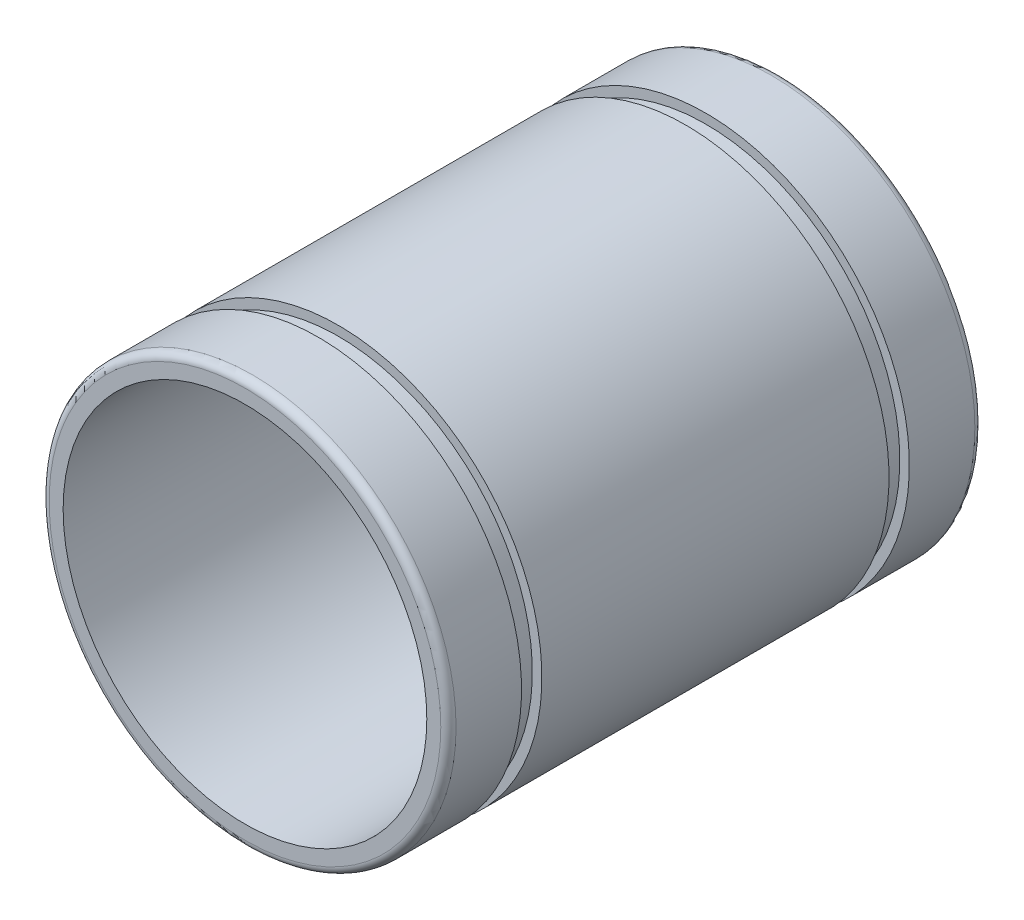
ISO-10303-21;
HEADER;
FILE_DESCRIPTION(('STEP AP214'),'2;1');
FILE_NAME('part.step','',(''),(''),'','','');
FILE_SCHEMA(('AUTOMOTIVE_DESIGN { 1 0 10303 214 1 1 1 1 }'));
ENDSEC;
DATA;
#1=APPLICATION_CONTEXT('core data for automotive mechanical design processes');
#2=APPLICATION_PROTOCOL_DEFINITION('international standard','automotive_design',2000,#1);
#3=PRODUCT_CONTEXT('',#1,'mechanical');
#4=PRODUCT('Part','Part','',(#3));
#5=PRODUCT_RELATED_PRODUCT_CATEGORY('part','',(#4));
#6=PRODUCT_DEFINITION_FORMATION('','',#4);
#7=PRODUCT_DEFINITION_CONTEXT('part definition',#1,'design');
#8=PRODUCT_DEFINITION('design','',#6,#7);
#9=PRODUCT_DEFINITION_SHAPE('','',#8);
#10=(LENGTH_UNIT() NAMED_UNIT(*) SI_UNIT(.MILLI.,.METRE.));
#11=(NAMED_UNIT(*) PLANE_ANGLE_UNIT() SI_UNIT($,.RADIAN.));
#12=(NAMED_UNIT(*) SI_UNIT($,.STERADIAN.) SOLID_ANGLE_UNIT());
#13=UNCERTAINTY_MEASURE_WITH_UNIT(LENGTH_MEASURE(1.E-05),#10,'distance_accuracy_value','');
#14=(GEOMETRIC_REPRESENTATION_CONTEXT(3) GLOBAL_UNCERTAINTY_ASSIGNED_CONTEXT((#13)) GLOBAL_UNIT_ASSIGNED_CONTEXT((#10,
#11,#12)) REPRESENTATION_CONTEXT('',''));
#15=CARTESIAN_POINT('',(0.,0.,0.));
#16=DIRECTION('',(0.,0.,1.));
#17=DIRECTION('',(1.,0.,0.));
#18=AXIS2_PLACEMENT_3D('',#15,#16,#17);
#19=CARTESIAN_POINT('',(0.,0.,42.));
#20=DIRECTION('',(0.,0.,-1.));
#21=DIRECTION('',(-1.,0.,0.));
#22=AXIS2_PLACEMENT_3D('',#19,#20,#21);
#23=CYLINDRICAL_SURFACE('',#22,16.);
#24=CARTESIAN_POINT('',(0.,0.,7.35000000000001));
#25=DIRECTION('',(0.,0.,-1.));
#26=DIRECTION('',(-1.,0.,0.));
#27=AXIS2_PLACEMENT_3D('',#24,#25,#26);
#28=CIRCLE('',#27,16.);
#29=CARTESIAN_POINT('',(-16.,0.,7.35000000000001));
#30=VERTEX_POINT('',#29);
#31=EDGE_CURVE('E54',#30,#30,#28,.T.);
#32=CARTESIAN_POINT('',(0.,0.,34.65));
#33=DIRECTION('',(0.,0.,-1.));
#34=DIRECTION('',(-1.,0.,0.));
#35=AXIS2_PLACEMENT_3D('',#32,#33,#34);
#36=CIRCLE('',#35,16.);
#37=CARTESIAN_POINT('',(-16.,0.,34.65));
#38=VERTEX_POINT('',#37);
#39=EDGE_CURVE('E68',#38,#38,#36,.T.);
#40=CARTESIAN_POINT('',(-16.,0.,7.35000000000001));
#41=CARTESIAN_POINT('',(-16.,0.,7.63437500000001));
#42=CARTESIAN_POINT('',(-16.,0.,7.91875000000001));
#43=CARTESIAN_POINT('',(-16.,0.,8.48750000000001));
#44=CARTESIAN_POINT('',(-16.,0.,8.77187500000001));
#45=CARTESIAN_POINT('',(-16.,0.,9.34062500000001));
#46=CARTESIAN_POINT('',(-16.,0.,9.62500000000001));
#47=CARTESIAN_POINT('',(-16.,0.,10.19375));
#48=CARTESIAN_POINT('',(-16.,0.,10.478125));
#49=CARTESIAN_POINT('',(-16.,0.,11.046875));
#50=CARTESIAN_POINT('',(-16.,0.,11.33125));
#51=CARTESIAN_POINT('',(-16.,0.,11.9));
#52=CARTESIAN_POINT('',(-16.,0.,12.184375));
#53=CARTESIAN_POINT('',(-16.,0.,12.753125));
#54=CARTESIAN_POINT('',(-16.,0.,13.0375));
#55=CARTESIAN_POINT('',(-16.,0.,13.60625));
#56=CARTESIAN_POINT('',(-16.,0.,13.890625));
#57=CARTESIAN_POINT('',(-16.,0.,14.459375));
#58=CARTESIAN_POINT('',(-16.,0.,14.74375));
#59=CARTESIAN_POINT('',(-16.,0.,15.3125));
#60=CARTESIAN_POINT('',(-16.,0.,15.596875));
#61=CARTESIAN_POINT('',(-16.,0.,16.165625));
#62=CARTESIAN_POINT('',(-16.,0.,16.45));
#63=CARTESIAN_POINT('',(-16.,0.,17.01875));
#64=CARTESIAN_POINT('',(-16.,0.,17.303125));
#65=CARTESIAN_POINT('',(-16.,0.,17.871875));
#66=CARTESIAN_POINT('',(-16.,0.,18.15625));
#67=CARTESIAN_POINT('',(-16.,0.,18.725));
#68=CARTESIAN_POINT('',(-16.,0.,19.009375));
#69=CARTESIAN_POINT('',(-16.,0.,19.578125));
#70=CARTESIAN_POINT('',(-16.,0.,19.8625));
#71=CARTESIAN_POINT('',(-16.,0.,20.43125));
#72=CARTESIAN_POINT('',(-16.,0.,20.715625));
#73=CARTESIAN_POINT('',(-16.,0.,21.284375));
#74=CARTESIAN_POINT('',(-16.,0.,21.56875));
#75=CARTESIAN_POINT('',(-16.,0.,22.1375));
#76=CARTESIAN_POINT('',(-16.,0.,22.421875));
#77=CARTESIAN_POINT('',(-16.,0.,22.990625));
#78=CARTESIAN_POINT('',(-16.,0.,23.275));
#79=CARTESIAN_POINT('',(-16.,0.,23.84375));
#80=CARTESIAN_POINT('',(-16.,0.,24.128125));
#81=CARTESIAN_POINT('',(-16.,0.,24.696875));
#82=CARTESIAN_POINT('',(-16.,0.,24.98125));
#83=CARTESIAN_POINT('',(-16.,0.,25.55));
#84=CARTESIAN_POINT('',(-16.,0.,25.834375));
#85=CARTESIAN_POINT('',(-16.,0.,26.403125));
#86=CARTESIAN_POINT('',(-16.,0.,26.6875));
#87=CARTESIAN_POINT('',(-16.,0.,27.25625));
#88=CARTESIAN_POINT('',(-16.,0.,27.540625));
#89=CARTESIAN_POINT('',(-16.,0.,28.109375));
#90=CARTESIAN_POINT('',(-16.,0.,28.39375));
#91=CARTESIAN_POINT('',(-16.,0.,28.9625));
#92=CARTESIAN_POINT('',(-16.,0.,29.246875));
#93=CARTESIAN_POINT('',(-16.,0.,29.815625));
#94=CARTESIAN_POINT('',(-16.,0.,30.1));
#95=CARTESIAN_POINT('',(-16.,0.,30.66875));
#96=CARTESIAN_POINT('',(-16.,0.,30.953125));
#97=CARTESIAN_POINT('',(-16.,0.,31.521875));
#98=CARTESIAN_POINT('',(-16.,0.,31.80625));
#99=CARTESIAN_POINT('',(-16.,0.,32.375));
#100=CARTESIAN_POINT('',(-16.,0.,32.659375));
#101=CARTESIAN_POINT('',(-16.,0.,33.228125));
#102=CARTESIAN_POINT('',(-16.,0.,33.5125));
#103=CARTESIAN_POINT('',(-16.,0.,34.08125));
#104=CARTESIAN_POINT('',(-16.,0.,34.365625));
#105=CARTESIAN_POINT('',(-16.,0.,34.65));
#106=B_SPLINE_CURVE_WITH_KNOTS('',3,(#40,#41,#42,#43,#44,#45,#46,#47,#48,#49,#50,#51,#52,#53,
#54,#55,#56,#57,#58,#59,#60,#61,#62,#63,#64,#65,#66,#67,#68,#69,#70,#71,#72,#73,#74,#75,#76,#77,
#78,#79,#80,#81,#82,#83,#84,#85,#86,#87,#88,#89,#90,#91,#92,#93,#94,#95,#96,#97,#98,#99,#100,
#101,#102,#103,#104,#105),.UNSPECIFIED.,.F.,.F.,(4,2,2,2,2,2,2,2,2,2,2,2,2,2,2,2,2,2,2,2,2,2,2,
2,2,2,2,2,2,2,2,2,4),(0.,0.853125000000003,1.70625,2.559375,3.4125,4.265625,5.11875,5.971875,
6.825,7.678125,8.53125,9.384375,10.2375,11.090625,11.94375,12.796875,13.65,14.503125,15.35625,
16.209375,17.0625,17.915625,18.76875,19.621875,20.475,21.328125,22.18125,23.034375,23.8875,
24.740625,25.59375,26.446875,27.3),.UNSPECIFIED.);
#107=EDGE_CURVE('BSEAM30',#30,#38,#106,.T.);
#108=ORIENTED_EDGE('',*,*,#31,.F.);
#109=ORIENTED_EDGE('',*,*,#39,.T.);
#110=ORIENTED_EDGE('',*,*,#107,.T.);
#111=ORIENTED_EDGE('',*,*,#107,.F.);
#112=EDGE_LOOP('',(#108,#110,#109,#111));
#113=FACE_BOUND('',#112,.T.);
#114=ADVANCED_FACE('F30',(#113),#23,.T.);
#115=CARTESIAN_POINT('',(0.,0.,41.4));
#116=DIRECTION('',(0.,0.,1.));
#117=DIRECTION('',(1.,0.,0.));
#118=AXIS2_PLACEMENT_3D('',#115,#116,#117);
#119=CIRCLE('',#118,16.);
#120=CARTESIAN_POINT('',(-16.,0.,41.4));
#121=VERTEX_POINT('',#120);
#122=EDGE_CURVE('E10',#121,#121,#119,.F.);
#123=CARTESIAN_POINT('',(0.,0.,36.25));
#124=DIRECTION('',(0.,0.,-1.));
#125=DIRECTION('',(-1.,0.,0.));
#126=AXIS2_PLACEMENT_3D('',#123,#124,#125);
#127=CIRCLE('',#126,16.);
#128=CARTESIAN_POINT('',(-16.,0.,36.25));
#129=VERTEX_POINT('',#128);
#130=EDGE_CURVE('E77',#129,#129,#127,.T.);
#131=CARTESIAN_POINT('',(-16.,0.,41.4));
#132=CARTESIAN_POINT('',(-16.,0.,41.3463541666667));
#133=CARTESIAN_POINT('',(-16.,0.,41.2927083333333));
#134=CARTESIAN_POINT('',(-16.,0.,41.1854166666667));
#135=CARTESIAN_POINT('',(-16.,0.,41.1317708333333));
#136=CARTESIAN_POINT('',(-16.,0.,41.0244791666667));
#137=CARTESIAN_POINT('',(-16.,0.,40.9708333333333));
#138=CARTESIAN_POINT('',(-16.,0.,40.8635416666667));
#139=CARTESIAN_POINT('',(-16.,0.,40.8098958333333));
#140=CARTESIAN_POINT('',(-16.,0.,40.7026041666667));
#141=CARTESIAN_POINT('',(-16.,0.,40.6489583333333));
#142=CARTESIAN_POINT('',(-16.,0.,40.5416666666667));
#143=CARTESIAN_POINT('',(-16.,0.,40.4880208333333));
#144=CARTESIAN_POINT('',(-16.,0.,40.3807291666667));
#145=CARTESIAN_POINT('',(-16.,0.,40.3270833333333));
#146=CARTESIAN_POINT('',(-16.,0.,40.2197916666667));
#147=CARTESIAN_POINT('',(-16.,0.,40.1661458333333));
#148=CARTESIAN_POINT('',(-16.,0.,40.0588541666667));
#149=CARTESIAN_POINT('',(-16.,0.,40.0052083333333));
#150=CARTESIAN_POINT('',(-16.,0.,39.8979166666667));
#151=CARTESIAN_POINT('',(-16.,0.,39.8442708333333));
#152=CARTESIAN_POINT('',(-16.,0.,39.7369791666667));
#153=CARTESIAN_POINT('',(-16.,0.,39.6833333333333));
#154=CARTESIAN_POINT('',(-16.,0.,39.5760416666667));
#155=CARTESIAN_POINT('',(-16.,0.,39.5223958333333));
#156=CARTESIAN_POINT('',(-16.,0.,39.4151041666667));
#157=CARTESIAN_POINT('',(-16.,0.,39.3614583333333));
#158=CARTESIAN_POINT('',(-16.,0.,39.2541666666667));
#159=CARTESIAN_POINT('',(-16.,0.,39.2005208333333));
#160=CARTESIAN_POINT('',(-16.,0.,39.0932291666667));
#161=CARTESIAN_POINT('',(-16.,0.,39.0395833333333));
#162=CARTESIAN_POINT('',(-16.,0.,38.9322916666667));
#163=CARTESIAN_POINT('',(-16.,0.,38.8786458333333));
#164=CARTESIAN_POINT('',(-16.,0.,38.7713541666667));
#165=CARTESIAN_POINT('',(-16.,0.,38.7177083333333));
#166=CARTESIAN_POINT('',(-16.,0.,38.6104166666667));
#167=CARTESIAN_POINT('',(-16.,0.,38.5567708333333));
#168=CARTESIAN_POINT('',(-16.,0.,38.4494791666667));
#169=CARTESIAN_POINT('',(-16.,0.,38.3958333333333));
#170=CARTESIAN_POINT('',(-16.,0.,38.2885416666667));
#171=CARTESIAN_POINT('',(-16.,0.,38.2348958333333));
#172=CARTESIAN_POINT('',(-16.,0.,38.1276041666667));
#173=CARTESIAN_POINT('',(-16.,0.,38.0739583333333));
#174=CARTESIAN_POINT('',(-16.,0.,37.9666666666667));
#175=CARTESIAN_POINT('',(-16.,0.,37.9130208333333));
#176=CARTESIAN_POINT('',(-16.,0.,37.8057291666667));
#177=CARTESIAN_POINT('',(-16.,0.,37.7520833333333));
#178=CARTESIAN_POINT('',(-16.,0.,37.6447916666667));
#179=CARTESIAN_POINT('',(-16.,0.,37.5911458333333));
#180=CARTESIAN_POINT('',(-16.,0.,37.4838541666667));
#181=CARTESIAN_POINT('',(-16.,0.,37.4302083333333));
#182=CARTESIAN_POINT('',(-16.,0.,37.3229166666667));
#183=CARTESIAN_POINT('',(-16.,0.,37.2692708333333));
#184=CARTESIAN_POINT('',(-16.,0.,37.1619791666667));
#185=CARTESIAN_POINT('',(-16.,0.,37.1083333333333));
#186=CARTESIAN_POINT('',(-16.,0.,37.0010416666667));
#187=CARTESIAN_POINT('',(-16.,0.,36.9473958333333));
#188=CARTESIAN_POINT('',(-16.,0.,36.8401041666667));
#189=CARTESIAN_POINT('',(-16.,0.,36.7864583333333));
#190=CARTESIAN_POINT('',(-16.,0.,36.6791666666667));
#191=CARTESIAN_POINT('',(-16.,0.,36.6255208333333));
#192=CARTESIAN_POINT('',(-16.,0.,36.5182291666667));
#193=CARTESIAN_POINT('',(-16.,0.,36.4645833333334));
#194=CARTESIAN_POINT('',(-16.,0.,36.3572916666667));
#195=CARTESIAN_POINT('',(-16.,0.,36.3036458333334));
#196=CARTESIAN_POINT('',(-16.,0.,36.25));
#197=B_SPLINE_CURVE_WITH_KNOTS('',3,(#131,#132,#133,#134,#135,#136,#137,#138,#139,#140,#141,
#142,#143,#144,#145,#146,#147,#148,#149,#150,#151,#152,#153,#154,#155,#156,#157,#158,#159,#160,
#161,#162,#163,#164,#165,#166,#167,#168,#169,#170,#171,#172,#173,#174,#175,#176,#177,#178,#179,
#180,#181,#182,#183,#184,#185,#186,#187,#188,#189,#190,#191,#192,#193,#194,#195,#196),
.UNSPECIFIED.,.F.,.F.,(4,2,2,2,2,2,2,2,2,2,2,2,2,2,2,2,2,2,2,2,2,2,2,2,2,2,2,2,2,2,2,2,4),(0.,
0.1609375,0.321874999999999,0.482812499999999,0.643749999999998,0.804687499999998,
0.965624999999998,1.1265625,1.2875,1.4484375,1.609375,1.7703125,1.93125,2.0921875,
2.25312499999999,2.41406249999999,2.57499999999999,2.73593749999999,2.89687499999999,
3.05781249999999,3.21874999999999,3.37968749999999,3.54062499999998,3.70156249999998,
3.86249999999998,4.02343749999998,4.18437499999998,4.34531249999998,4.50624999999998,
4.66718749999998,4.82812499999998,4.98906249999997,5.14999999999997),.UNSPECIFIED.);
#198=EDGE_CURVE('BSEAM84',#121,#129,#197,.T.);
#199=ORIENTED_EDGE('',*,*,#122,.T.);
#200=ORIENTED_EDGE('',*,*,#130,.F.);
#201=ORIENTED_EDGE('',*,*,#198,.T.);
#202=ORIENTED_EDGE('',*,*,#198,.F.);
#203=EDGE_LOOP('',(#199,#201,#200,#202));
#204=FACE_BOUND('',#203,.T.);
#205=ADVANCED_FACE('F84',(#204),#23,.T.);
#206=CARTESIAN_POINT('',(0.,0.,0.600000000000003));
#207=DIRECTION('',(0.,0.,1.));
#208=DIRECTION('',(1.,0.,0.));
#209=AXIS2_PLACEMENT_3D('',#206,#207,#208);
#210=CIRCLE('',#209,16.);
#211=CARTESIAN_POINT('',(-16.,0.,0.600000000000003));
#212=VERTEX_POINT('',#211);
#213=EDGE_CURVE('E45',#212,#212,#210,.T.);
#214=CARTESIAN_POINT('',(0.,0.,5.75000000000001));
#215=DIRECTION('',(0.,0.,-1.));
#216=DIRECTION('',(-1.,0.,0.));
#217=AXIS2_PLACEMENT_3D('',#214,#215,#216);
#218=CIRCLE('',#217,16.);
#219=CARTESIAN_POINT('',(-16.,0.,5.75000000000002));
#220=VERTEX_POINT('',#219);
#221=EDGE_CURVE('E65',#220,#220,#218,.T.);
#222=CARTESIAN_POINT('',(-16.,0.,0.600000000000003));
#223=CARTESIAN_POINT('',(-16.,0.,0.653645833333337));
#224=CARTESIAN_POINT('',(-16.,0.,0.70729166666667));
#225=CARTESIAN_POINT('',(-16.,0.,0.814583333333336));
#226=CARTESIAN_POINT('',(-16.,0.,0.868229166666669));
#227=CARTESIAN_POINT('',(-16.,0.,0.975520833333336));
#228=CARTESIAN_POINT('',(-16.,0.,1.02916666666667));
#229=CARTESIAN_POINT('',(-16.,0.,1.13645833333334));
#230=CARTESIAN_POINT('',(-16.,0.,1.19010416666667));
#231=CARTESIAN_POINT('',(-16.,0.,1.29739583333334));
#232=CARTESIAN_POINT('',(-16.,0.,1.35104166666667));
#233=CARTESIAN_POINT('',(-16.,0.,1.45833333333334));
#234=CARTESIAN_POINT('',(-16.,0.,1.51197916666667));
#235=CARTESIAN_POINT('',(-16.,0.,1.61927083333334));
#236=CARTESIAN_POINT('',(-16.,0.,1.67291666666667));
#237=CARTESIAN_POINT('',(-16.,0.,1.78020833333334));
#238=CARTESIAN_POINT('',(-16.,0.,1.83385416666667));
#239=CARTESIAN_POINT('',(-16.,0.,1.94114583333334));
#240=CARTESIAN_POINT('',(-16.,0.,1.99479166666667));
#241=CARTESIAN_POINT('',(-16.,0.,2.10208333333334));
#242=CARTESIAN_POINT('',(-16.,0.,2.15572916666667));
#243=CARTESIAN_POINT('',(-16.,0.,2.26302083333334));
#244=CARTESIAN_POINT('',(-16.,0.,2.31666666666667));
#245=CARTESIAN_POINT('',(-16.,0.,2.42395833333334));
#246=CARTESIAN_POINT('',(-16.,0.,2.47760416666668));
#247=CARTESIAN_POINT('',(-16.,0.,2.58489583333335));
#248=CARTESIAN_POINT('',(-16.,0.,2.63854166666668));
#249=CARTESIAN_POINT('',(-16.,0.,2.74583333333335));
#250=CARTESIAN_POINT('',(-16.,0.,2.79947916666668));
#251=CARTESIAN_POINT('',(-16.,0.,2.90677083333334));
#252=CARTESIAN_POINT('',(-16.,0.,2.96041666666668));
#253=CARTESIAN_POINT('',(-16.,0.,3.06770833333334));
#254=CARTESIAN_POINT('',(-16.,0.,3.12135416666668));
#255=CARTESIAN_POINT('',(-16.,0.,3.22864583333334));
#256=CARTESIAN_POINT('',(-16.,0.,3.28229166666668));
#257=CARTESIAN_POINT('',(-16.,0.,3.38958333333334));
#258=CARTESIAN_POINT('',(-16.,0.,3.44322916666668));
#259=CARTESIAN_POINT('',(-16.,0.,3.55052083333334));
#260=CARTESIAN_POINT('',(-16.,0.,3.60416666666668));
#261=CARTESIAN_POINT('',(-16.,0.,3.71145833333334));
#262=CARTESIAN_POINT('',(-16.,0.,3.76510416666668));
#263=CARTESIAN_POINT('',(-16.,0.,3.87239583333335));
#264=CARTESIAN_POINT('',(-16.,0.,3.92604166666668));
#265=CARTESIAN_POINT('',(-16.,0.,4.03333333333335));
#266=CARTESIAN_POINT('',(-16.,0.,4.08697916666668));
#267=CARTESIAN_POINT('',(-16.,0.,4.19427083333335));
#268=CARTESIAN_POINT('',(-16.,0.,4.24791666666668));
#269=CARTESIAN_POINT('',(-16.,0.,4.35520833333335));
#270=CARTESIAN_POINT('',(-16.,0.,4.40885416666668));
#271=CARTESIAN_POINT('',(-16.,0.,4.51614583333335));
#272=CARTESIAN_POINT('',(-16.,0.,4.56979166666668));
#273=CARTESIAN_POINT('',(-16.,0.,4.67708333333335));
#274=CARTESIAN_POINT('',(-16.,0.,4.73072916666668));
#275=CARTESIAN_POINT('',(-16.,0.,4.83802083333335));
#276=CARTESIAN_POINT('',(-16.,0.,4.89166666666668));
#277=CARTESIAN_POINT('',(-16.,0.,4.99895833333335));
#278=CARTESIAN_POINT('',(-16.,0.,5.05260416666669));
#279=CARTESIAN_POINT('',(-16.,0.,5.15989583333335));
#280=CARTESIAN_POINT('',(-16.,0.,5.21354166666669));
#281=CARTESIAN_POINT('',(-16.,0.,5.32083333333335));
#282=CARTESIAN_POINT('',(-16.,0.,5.37447916666669));
#283=CARTESIAN_POINT('',(-16.,0.,5.48177083333335));
#284=CARTESIAN_POINT('',(-16.,0.,5.53541666666669));
#285=CARTESIAN_POINT('',(-16.,0.,5.64270833333335));
#286=CARTESIAN_POINT('',(-16.,0.,5.69635416666669));
#287=CARTESIAN_POINT('',(-16.,0.,5.75000000000002));
#288=B_SPLINE_CURVE_WITH_KNOTS('',3,(#222,#223,#224,#225,#226,#227,#228,#229,#230,#231,#232,
#233,#234,#235,#236,#237,#238,#239,#240,#241,#242,#243,#244,#245,#246,#247,#248,#249,#250,#251,
#252,#253,#254,#255,#256,#257,#258,#259,#260,#261,#262,#263,#264,#265,#266,#267,#268,#269,#270,
#271,#272,#273,#274,#275,#276,#277,#278,#279,#280,#281,#282,#283,#284,#285,#286,#287),
.UNSPECIFIED.,.F.,.F.,(4,2,2,2,2,2,2,2,2,2,2,2,2,2,2,2,2,2,2,2,2,2,2,2,2,2,2,2,2,2,2,2,4),(0.,
0.1609375,0.321874999999999,0.482812499999999,0.643749999999998,0.804687500000005,
0.965625000000005,1.1265625,1.2875,1.4484375,1.609375,1.7703125,1.93125000000001,
2.09218750000001,2.25312500000001,2.41406250000001,2.57500000000001,2.73593750000001,
2.89687500000001,3.05781250000001,3.21875000000001,3.37968750000001,3.54062500000001,
3.70156250000001,3.86250000000001,4.02343750000001,4.18437500000001,4.34531250000001,
4.50625000000002,4.66718750000002,4.82812500000002,4.98906250000002,5.15000000000002),.UNSPECIFIED.);
#289=EDGE_CURVE('BSEAM86',#212,#220,#288,.T.);
#290=ORIENTED_EDGE('',*,*,#213,.T.);
#291=ORIENTED_EDGE('',*,*,#221,.T.);
#292=ORIENTED_EDGE('',*,*,#289,.T.);
#293=ORIENTED_EDGE('',*,*,#289,.F.);
#294=EDGE_LOOP('',(#290,#292,#291,#293));
#295=FACE_BOUND('',#294,.T.);
#296=ADVANCED_FACE('F86',(#295),#23,.T.);
#297=CARTESIAN_POINT('',(0.,0.,42.));
#298=DIRECTION('',(0.,0.,1.));
#299=DIRECTION('',(1.,0.,0.));
#300=AXIS2_PLACEMENT_3D('',#297,#298,#299);
#301=PLANE('',#300);
#302=CARTESIAN_POINT('',(0.,0.,42.));
#303=DIRECTION('',(0.,0.,1.));
#304=DIRECTION('',(1.,0.,0.));
#305=AXIS2_PLACEMENT_3D('',#302,#303,#304);
#306=CIRCLE('',#305,15.4);
#307=CARTESIAN_POINT('',(15.4,0.,42.));
#308=VERTEX_POINT('',#307);
#309=EDGE_CURVE('E37',#308,#308,#306,.T.);
#310=ORIENTED_EDGE('',*,*,#309,.T.);
#311=EDGE_LOOP('',(#310));
#312=FACE_BOUND('',#311,.T.);
#313=CARTESIAN_POINT('',(0.,0.,42.));
#314=DIRECTION('',(0.,0.,1.));
#315=DIRECTION('',(1.,0.,0.));
#316=AXIS2_PLACEMENT_3D('',#313,#314,#315);
#317=CIRCLE('',#316,14.3);
#318=CARTESIAN_POINT('',(-14.3,0.,42.));
#319=VERTEX_POINT('',#318);
#320=EDGE_CURVE('E50',#319,#319,#317,.T.);
#321=ORIENTED_EDGE('',*,*,#320,.F.);
#322=EDGE_LOOP('',(#321));
#323=FACE_BOUND('',#322,.T.);
#324=ADVANCED_FACE('F92',(#312,#323),#301,.T.);
#325=CARTESIAN_POINT('',(0.,0.,0.));
#326=DIRECTION('',(0.,0.,1.));
#327=DIRECTION('',(1.,0.,0.));
#328=AXIS2_PLACEMENT_3D('',#325,#326,#327);
#329=PLANE('',#328);
#330=CARTESIAN_POINT('',(0.,0.,0.));
#331=DIRECTION('',(0.,0.,1.));
#332=DIRECTION('',(1.,0.,0.));
#333=AXIS2_PLACEMENT_3D('',#330,#331,#332);
#334=CIRCLE('',#333,15.4);
#335=CARTESIAN_POINT('',(15.4,0.,0.));
#336=VERTEX_POINT('',#335);
#337=EDGE_CURVE('E41',#336,#336,#334,.F.);
#338=ORIENTED_EDGE('',*,*,#337,.T.);
#339=EDGE_LOOP('',(#338));
#340=FACE_BOUND('',#339,.T.);
#341=CARTESIAN_POINT('',(0.,0.,0.));
#342=DIRECTION('',(0.,0.,1.));
#343=DIRECTION('',(1.,0.,0.));
#344=AXIS2_PLACEMENT_3D('',#341,#342,#343);
#345=CIRCLE('',#344,14.3);
#346=CARTESIAN_POINT('',(-14.3,0.,0.));
#347=VERTEX_POINT('',#346);
#348=EDGE_CURVE('E51',#347,#347,#345,.T.);
#349=ORIENTED_EDGE('',*,*,#348,.T.);
#350=EDGE_LOOP('',(#349));
#351=FACE_BOUND('',#350,.T.);
#352=ADVANCED_FACE('F96',(#340,#351),#329,.F.);
#353=CARTESIAN_POINT('',(0.,0.,42.));
#354=DIRECTION('',(0.,0.,-1.));
#355=DIRECTION('',(-1.,0.,0.));
#356=AXIS2_PLACEMENT_3D('',#353,#354,#355);
#357=CYLINDRICAL_SURFACE('',#356,14.3);
#358=CARTESIAN_POINT('',(-14.3,0.,42.));
#359=CARTESIAN_POINT('',(-14.3,0.,41.5625));
#360=CARTESIAN_POINT('',(-14.3,0.,41.125));
#361=CARTESIAN_POINT('',(-14.3,0.,40.25));
#362=CARTESIAN_POINT('',(-14.3,0.,39.8125));
#363=CARTESIAN_POINT('',(-14.3,0.,38.9375));
#364=CARTESIAN_POINT('',(-14.3,0.,38.5));
#365=CARTESIAN_POINT('',(-14.3,0.,37.625));
#366=CARTESIAN_POINT('',(-14.3,0.,37.1875));
#367=CARTESIAN_POINT('',(-14.3,0.,36.3125));
#368=CARTESIAN_POINT('',(-14.3,0.,35.875));
#369=CARTESIAN_POINT('',(-14.3,0.,35.));
#370=CARTESIAN_POINT('',(-14.3,0.,34.5625));
#371=CARTESIAN_POINT('',(-14.3,0.,33.6875));
#372=CARTESIAN_POINT('',(-14.3,0.,33.25));
#373=CARTESIAN_POINT('',(-14.3,0.,32.375));
#374=CARTESIAN_POINT('',(-14.3,0.,31.9375));
#375=CARTESIAN_POINT('',(-14.3,0.,31.0625));
#376=CARTESIAN_POINT('',(-14.3,0.,30.625));
#377=CARTESIAN_POINT('',(-14.3,0.,29.75));
#378=CARTESIAN_POINT('',(-14.3,0.,29.3125));
#379=CARTESIAN_POINT('',(-14.3,0.,28.4375));
#380=CARTESIAN_POINT('',(-14.3,0.,28.));
#381=CARTESIAN_POINT('',(-14.3,0.,27.125));
#382=CARTESIAN_POINT('',(-14.3,0.,26.6875));
#383=CARTESIAN_POINT('',(-14.3,0.,25.8125));
#384=CARTESIAN_POINT('',(-14.3,0.,25.375));
#385=CARTESIAN_POINT('',(-14.3,0.,24.5));
#386=CARTESIAN_POINT('',(-14.3,0.,24.0625));
#387=CARTESIAN_POINT('',(-14.3,0.,23.1875));
#388=CARTESIAN_POINT('',(-14.3,0.,22.75));
#389=CARTESIAN_POINT('',(-14.3,0.,21.875));
#390=CARTESIAN_POINT('',(-14.3,0.,21.4375));
#391=CARTESIAN_POINT('',(-14.3,0.,20.5625));
#392=CARTESIAN_POINT('',(-14.3,0.,20.125));
#393=CARTESIAN_POINT('',(-14.3,0.,19.25));
#394=CARTESIAN_POINT('',(-14.3,0.,18.8125));
#395=CARTESIAN_POINT('',(-14.3,0.,17.9375));
#396=CARTESIAN_POINT('',(-14.3,0.,17.5));
#397=CARTESIAN_POINT('',(-14.3,0.,16.625));
#398=CARTESIAN_POINT('',(-14.3,0.,16.1875));
#399=CARTESIAN_POINT('',(-14.3,0.,15.3125));
#400=CARTESIAN_POINT('',(-14.3,0.,14.875));
#401=CARTESIAN_POINT('',(-14.3,0.,14.));
#402=CARTESIAN_POINT('',(-14.3,0.,13.5625));
#403=CARTESIAN_POINT('',(-14.3,0.,12.6875));
#404=CARTESIAN_POINT('',(-14.3,0.,12.25));
#405=CARTESIAN_POINT('',(-14.3,0.,11.375));
#406=CARTESIAN_POINT('',(-14.3,0.,10.9375));
#407=CARTESIAN_POINT('',(-14.3,0.,10.0625));
#408=CARTESIAN_POINT('',(-14.3,0.,9.625));
#409=CARTESIAN_POINT('',(-14.3,0.,8.75));
#410=CARTESIAN_POINT('',(-14.3,0.,8.3125));
#411=CARTESIAN_POINT('',(-14.3,0.,7.4375));
#412=CARTESIAN_POINT('',(-14.3,0.,7.));
#413=CARTESIAN_POINT('',(-14.3,0.,6.125));
#414=CARTESIAN_POINT('',(-14.3,0.,5.6875));
#415=CARTESIAN_POINT('',(-14.3,0.,4.8125));
#416=CARTESIAN_POINT('',(-14.3,0.,4.375));
#417=CARTESIAN_POINT('',(-14.3,0.,3.5));
#418=CARTESIAN_POINT('',(-14.3,0.,3.0625));
#419=CARTESIAN_POINT('',(-14.3,0.,2.1875));
#420=CARTESIAN_POINT('',(-14.3,0.,1.75));
#421=CARTESIAN_POINT('',(-14.3,0.,0.875000000000001));
#422=CARTESIAN_POINT('',(-14.3,0.,0.4375));
#423=CARTESIAN_POINT('',(-14.3,0.,0.));
#424=B_SPLINE_CURVE_WITH_KNOTS('',3,(#358,#359,#360,#361,#362,#363,#364,#365,#366,#367,#368,
#369,#370,#371,#372,#373,#374,#375,#376,#377,#378,#379,#380,#381,#382,#383,#384,#385,#386,#387,
#388,#389,#390,#391,#392,#393,#394,#395,#396,#397,#398,#399,#400,#401,#402,#403,#404,#405,#406,
#407,#408,#409,#410,#411,#412,#413,#414,#415,#416,#417,#418,#419,#420,#421,#422,#423),
.UNSPECIFIED.,.F.,.F.,(4,2,2,2,2,2,2,2,2,2,2,2,2,2,2,2,2,2,2,2,2,2,2,2,2,2,2,2,2,2,2,2,4),(0.,
1.31249999999999,2.625,3.9375,5.25,6.5625,7.87499999999999,9.18749999999999,10.5,11.8125,13.125,
14.4375,15.75,17.0625,18.375,19.6875,21.,22.3125,23.625,24.9375,26.25,27.5625,28.875,30.1875,
31.5,32.8125,34.125,35.4375,36.75,38.0625,39.375,40.6875,42.),.UNSPECIFIED.);
#425=EDGE_CURVE('BSEAM133',#319,#347,#424,.T.);
#426=ORIENTED_EDGE('',*,*,#320,.T.);
#427=ORIENTED_EDGE('',*,*,#348,.F.);
#428=ORIENTED_EDGE('',*,*,#425,.T.);
#429=ORIENTED_EDGE('',*,*,#425,.F.);
#430=EDGE_LOOP('',(#426,#428,#427,#429));
#431=FACE_BOUND('',#430,.T.);
#432=ADVANCED_FACE('F133',(#431),#357,.F.);
#433=CARTESIAN_POINT('',(16.,0.,7.35000000000001));
#434=DIRECTION('',(0.,0.,-1.));
#435=DIRECTION('',(-1.,0.,0.));
#436=AXIS2_PLACEMENT_3D('',#433,#434,#435);
#437=PLANE('',#436);
#438=ORIENTED_EDGE('',*,*,#31,.T.);
#439=EDGE_LOOP('',(#438));
#440=FACE_BOUND('',#439,.T.);
#441=CARTESIAN_POINT('',(0.,0.,7.35000000000002));
#442=DIRECTION('',(0.,0.,-1.));
#443=DIRECTION('',(-1.,0.,0.));
#444=AXIS2_PLACEMENT_3D('',#441,#442,#443);
#445=CIRCLE('',#444,15.25);
#446=CARTESIAN_POINT('',(-15.25,0.,7.35000000000002));
#447=VERTEX_POINT('',#446);
#448=EDGE_CURVE('E59',#447,#447,#445,.T.);
#449=ORIENTED_EDGE('',*,*,#448,.F.);
#450=EDGE_LOOP('',(#449));
#451=FACE_BOUND('',#450,.T.);
#452=ADVANCED_FACE('F126',(#440,#451),#437,.T.);
#453=CARTESIAN_POINT('',(0.,0.,0.));
#454=DIRECTION('',(0.,0.,-1.));
#455=DIRECTION('',(-1.,0.,0.));
#456=AXIS2_PLACEMENT_3D('',#453,#454,#455);
#457=CYLINDRICAL_SURFACE('',#456,15.25);
#458=ORIENTED_EDGE('',*,*,#448,.T.);
#459=EDGE_LOOP('',(#458));
#460=FACE_BOUND('',#459,.T.);
#461=CARTESIAN_POINT('',(0.,0.,5.75000000000002));
#462=DIRECTION('',(0.,0.,-1.));
#463=DIRECTION('',(-1.,0.,0.));
#464=AXIS2_PLACEMENT_3D('',#461,#462,#463);
#465=CIRCLE('',#464,15.25);
#466=CARTESIAN_POINT('',(-15.25,0.,5.75000000000002));
#467=VERTEX_POINT('',#466);
#468=EDGE_CURVE('E62',#467,#467,#465,.T.);
#469=ORIENTED_EDGE('',*,*,#468,.F.);
#470=EDGE_LOOP('',(#469));
#471=FACE_BOUND('',#470,.T.);
#472=ADVANCED_FACE('F117',(#460,#471),#457,.T.);
#473=CARTESIAN_POINT('',(16.,0.,5.75000000000001));
#474=DIRECTION('',(0.,0.,1.));
#475=DIRECTION('',(1.,0.,0.));
#476=AXIS2_PLACEMENT_3D('',#473,#474,#475);
#477=PLANE('',#476);
#478=ORIENTED_EDGE('',*,*,#468,.T.);
#479=EDGE_LOOP('',(#478));
#480=FACE_BOUND('',#479,.T.);
#481=ORIENTED_EDGE('',*,*,#221,.F.);
#482=EDGE_LOOP('',(#481));
#483=FACE_BOUND('',#482,.T.);
#484=ADVANCED_FACE('F114',(#480,#483),#477,.T.);
#485=CARTESIAN_POINT('',(16.,0.,34.65));
#486=DIRECTION('',(0.,0.,1.));
#487=DIRECTION('',(1.,0.,0.));
#488=AXIS2_PLACEMENT_3D('',#485,#486,#487);
#489=PLANE('',#488);
#490=CARTESIAN_POINT('',(0.,0.,34.65));
#491=DIRECTION('',(0.,0.,-1.));
#492=DIRECTION('',(-1.,0.,0.));
#493=AXIS2_PLACEMENT_3D('',#490,#491,#492);
#494=CIRCLE('',#493,15.25);
#495=CARTESIAN_POINT('',(-15.25,0.,34.65));
#496=VERTEX_POINT('',#495);
#497=EDGE_CURVE('E71',#496,#496,#494,.T.);
#498=ORIENTED_EDGE('',*,*,#497,.T.);
#499=EDGE_LOOP('',(#498));
#500=FACE_BOUND('',#499,.T.);
#501=ORIENTED_EDGE('',*,*,#39,.F.);
#502=EDGE_LOOP('',(#501));
#503=FACE_BOUND('',#502,.T.);
#504=ADVANCED_FACE('F116',(#500,#503),#489,.T.);
#505=CARTESIAN_POINT('',(0.,0.,0.));
#506=DIRECTION('',(0.,0.,-1.));
#507=DIRECTION('',(-1.,0.,0.));
#508=AXIS2_PLACEMENT_3D('',#505,#506,#507);
#509=CYLINDRICAL_SURFACE('',#508,15.25);
#510=CARTESIAN_POINT('',(0.,0.,36.25));
#511=DIRECTION('',(0.,0.,-1.));
#512=DIRECTION('',(-1.,0.,0.));
#513=AXIS2_PLACEMENT_3D('',#510,#511,#512);
#514=CIRCLE('',#513,15.25);
#515=CARTESIAN_POINT('',(-15.25,0.,36.25));
#516=VERTEX_POINT('',#515);
#517=EDGE_CURVE('E74',#516,#516,#514,.T.);
#518=ORIENTED_EDGE('',*,*,#517,.T.);
#519=EDGE_LOOP('',(#518));
#520=FACE_BOUND('',#519,.T.);
#521=ORIENTED_EDGE('',*,*,#497,.F.);
#522=EDGE_LOOP('',(#521));
#523=FACE_BOUND('',#522,.T.);
#524=ADVANCED_FACE('F106',(#520,#523),#509,.T.);
#525=CARTESIAN_POINT('',(16.,0.,36.25));
#526=DIRECTION('',(0.,0.,-1.));
#527=DIRECTION('',(-1.,0.,0.));
#528=AXIS2_PLACEMENT_3D('',#525,#526,#527);
#529=PLANE('',#528);
#530=ORIENTED_EDGE('',*,*,#130,.T.);
#531=EDGE_LOOP('',(#530));
#532=FACE_BOUND('',#531,.T.);
#533=ORIENTED_EDGE('',*,*,#517,.F.);
#534=EDGE_LOOP('',(#533));
#535=FACE_BOUND('',#534,.T.);
#536=ADVANCED_FACE('F81',(#532,#535),#529,.T.);
#537=CARTESIAN_POINT('',(0.,0.,0.600000000000003));
#538=DIRECTION('',(0.,0.,1.));
#539=DIRECTION('',(1.,0.,0.));
#540=AXIS2_PLACEMENT_3D('',#537,#538,#539);
#541=TOROIDAL_SURFACE('',#540,15.4,0.6);
#542=ORIENTED_EDGE('',*,*,#337,.F.);
#543=EDGE_LOOP('',(#542));
#544=FACE_BOUND('',#543,.T.);
#545=ORIENTED_EDGE('',*,*,#213,.F.);
#546=EDGE_LOOP('',(#545));
#547=FACE_BOUND('',#546,.T.);
#548=ADVANCED_FACE('F98',(#544,#547),#541,.T.);
#549=CARTESIAN_POINT('',(0.,0.,41.4));
#550=DIRECTION('',(0.,0.,1.));
#551=DIRECTION('',(1.,0.,0.));
#552=AXIS2_PLACEMENT_3D('',#549,#550,#551);
#553=TOROIDAL_SURFACE('',#552,15.4,0.6);
#554=ORIENTED_EDGE('',*,*,#122,.F.);
#555=EDGE_LOOP('',(#554));
#556=FACE_BOUND('',#555,.T.);
#557=ORIENTED_EDGE('',*,*,#309,.F.);
#558=EDGE_LOOP('',(#557));
#559=FACE_BOUND('',#558,.T.);
#560=ADVANCED_FACE('F32',(#556,#559),#553,.T.);
#561=CLOSED_SHELL('',(#114,#205,#296,#324,#352,#432,#452,#472,#484,#504,#524,#536,#548,#560));
#562=MANIFOLD_SOLID_BREP('B2',#561);
#563=ADVANCED_BREP_SHAPE_REPRESENTATION('',(#18,#562),#14);
#564=SHAPE_DEFINITION_REPRESENTATION(#9,#563);
ENDSEC;
END-ISO-10303-21;
